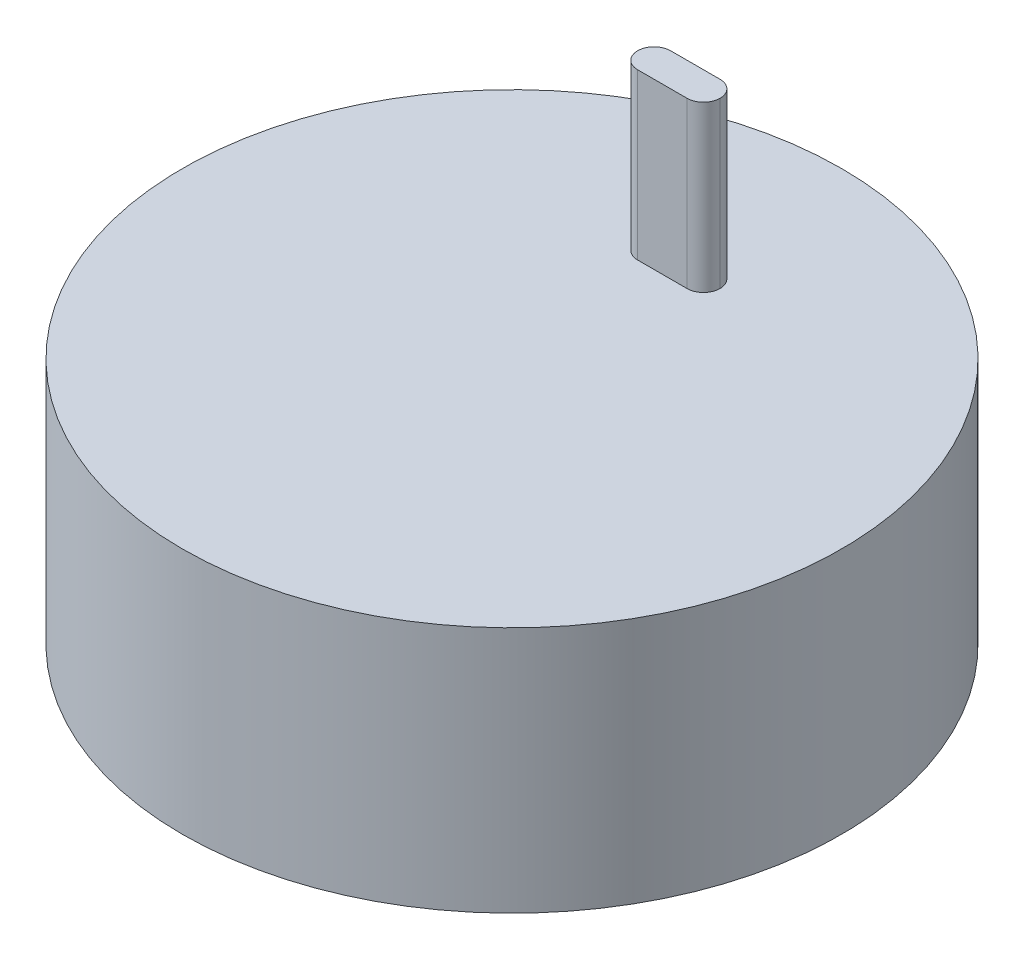
ISO-10303-21;
HEADER;
FILE_DESCRIPTION(('STEP AP214'),'2;1');
FILE_NAME('part.step','',(''),(''),'','','');
FILE_SCHEMA(('AUTOMOTIVE_DESIGN { 1 0 10303 214 1 1 1 1 }'));
ENDSEC;
DATA;
#1=APPLICATION_CONTEXT('core data for automotive mechanical design processes');
#2=APPLICATION_PROTOCOL_DEFINITION('international standard','automotive_design',2000,#1);
#3=PRODUCT_CONTEXT('',#1,'mechanical');
#4=PRODUCT('Part','Part','',(#3));
#5=PRODUCT_RELATED_PRODUCT_CATEGORY('part','',(#4));
#6=PRODUCT_DEFINITION_FORMATION('','',#4);
#7=PRODUCT_DEFINITION_CONTEXT('part definition',#1,'design');
#8=PRODUCT_DEFINITION('design','',#6,#7);
#9=PRODUCT_DEFINITION_SHAPE('','',#8);
#10=(LENGTH_UNIT() NAMED_UNIT(*) SI_UNIT(.MILLI.,.METRE.));
#11=(NAMED_UNIT(*) PLANE_ANGLE_UNIT() SI_UNIT($,.RADIAN.));
#12=(NAMED_UNIT(*) SI_UNIT($,.STERADIAN.) SOLID_ANGLE_UNIT());
#13=UNCERTAINTY_MEASURE_WITH_UNIT(LENGTH_MEASURE(1.E-05),#10,'distance_accuracy_value','');
#14=(GEOMETRIC_REPRESENTATION_CONTEXT(3) GLOBAL_UNCERTAINTY_ASSIGNED_CONTEXT((#13)) GLOBAL_UNIT_ASSIGNED_CONTEXT((#10,
#11,#12)) REPRESENTATION_CONTEXT('',''));
#15=CARTESIAN_POINT('',(0.,0.,0.));
#16=DIRECTION('',(0.,0.,1.));
#17=DIRECTION('',(1.,0.,0.));
#18=AXIS2_PLACEMENT_3D('',#15,#16,#17);
#19=CARTESIAN_POINT('',(0.,15.,0.));
#20=DIRECTION('',(0.,1.,0.));
#21=DIRECTION('',(0.,0.,1.));
#22=AXIS2_PLACEMENT_3D('',#19,#20,#21);
#23=PLANE('',#22);
#24=CARTESIAN_POINT('',(0.,15.,0.));
#25=DIRECTION('',(0.,1.,0.));
#26=DIRECTION('',(0.,0.,1.));
#27=AXIS2_PLACEMENT_3D('',#24,#25,#26);
#28=CIRCLE('',#27,20.);
#29=CARTESIAN_POINT('',(0.,15.,20.));
#30=VERTEX_POINT('',#29);
#31=EDGE_CURVE('E116',#30,#30,#28,.T.);
#32=ORIENTED_EDGE('',*,*,#31,.T.);
#33=EDGE_LOOP('',(#32));
#34=FACE_BOUND('',#33,.T.);
#35=DIRECTION('',(1.,0.,0.));
#36=VECTOR('',#35,1.);
#37=CARTESIAN_POINT('',(2.62526317716629,15.,-9.));
#38=LINE('',#37,#36);
#39=CARTESIAN_POINT('',(-1.37473682283371,15.,-9.));
#40=VERTEX_POINT('',#39);
#41=CARTESIAN_POINT('',(1.62526317716629,15.,-9.));
#42=VERTEX_POINT('',#41);
#43=EDGE_CURVE('E121',#40,#42,#38,.T.);
#44=ORIENTED_EDGE('',*,*,#43,.F.);
#45=CARTESIAN_POINT('',(-1.37473682283371,15.,-10.));
#46=DIRECTION('',(0.,1.,0.));
#47=DIRECTION('',(0.,0.,1.));
#48=AXIS2_PLACEMENT_3D('',#45,#46,#47);
#49=CIRCLE('',#48,1.);
#50=CARTESIAN_POINT('',(-2.37473682283371,15.,-10.));
#51=VERTEX_POINT('',#50);
#52=EDGE_CURVE('E53',#40,#51,#49,.F.);
#53=ORIENTED_EDGE('',*,*,#52,.T.);
#54=CARTESIAN_POINT('',(-1.37473682283371,15.,-10.));
#55=DIRECTION('',(0.,1.,0.));
#56=DIRECTION('',(0.,0.,1.));
#57=AXIS2_PLACEMENT_3D('',#54,#55,#56);
#58=CIRCLE('',#57,1.);
#59=CARTESIAN_POINT('',(-1.37473682283371,15.,-11.));
#60=VERTEX_POINT('',#59);
#61=EDGE_CURVE('E103',#51,#60,#58,.F.);
#62=ORIENTED_EDGE('',*,*,#61,.T.);
#63=DIRECTION('',(-1.,0.,0.));
#64=VECTOR('',#63,1.);
#65=CARTESIAN_POINT('',(2.62526317716629,15.,-11.));
#66=LINE('',#65,#64);
#67=CARTESIAN_POINT('',(1.62526317716629,15.,-11.));
#68=VERTEX_POINT('',#67);
#69=EDGE_CURVE('E110',#68,#60,#66,.T.);
#70=ORIENTED_EDGE('',*,*,#69,.F.);
#71=CARTESIAN_POINT('',(1.62526317716629,15.,-10.));
#72=DIRECTION('',(0.,1.,0.));
#73=DIRECTION('',(0.,0.,1.));
#74=AXIS2_PLACEMENT_3D('',#71,#72,#73);
#75=CIRCLE('',#74,1.);
#76=CARTESIAN_POINT('',(2.62526317716629,15.,-10.));
#77=VERTEX_POINT('',#76);
#78=EDGE_CURVE('E60',#68,#77,#75,.F.);
#79=ORIENTED_EDGE('',*,*,#78,.T.);
#80=CARTESIAN_POINT('',(1.62526317716629,15.,-10.));
#81=DIRECTION('',(0.,1.,0.));
#82=DIRECTION('',(0.,0.,1.));
#83=AXIS2_PLACEMENT_3D('',#80,#81,#82);
#84=CIRCLE('',#83,1.);
#85=EDGE_CURVE('E11',#77,#42,#84,.F.);
#86=ORIENTED_EDGE('',*,*,#85,.T.);
#87=EDGE_LOOP('',(#44,#53,#62,#70,#79,#86));
#88=FACE_BOUND('',#87,.T.);
#89=ADVANCED_FACE('F43',(#34,#88),#23,.T.);
#90=CARTESIAN_POINT('',(0.,15.,0.));
#91=DIRECTION('',(0.,-1.,0.));
#92=DIRECTION('',(0.,0.,-1.));
#93=AXIS2_PLACEMENT_3D('',#90,#91,#92);
#94=CYLINDRICAL_SURFACE('',#93,20.);
#95=ORIENTED_EDGE('',*,*,#31,.F.);
#96=EDGE_LOOP('',(#95));
#97=FACE_BOUND('',#96,.T.);
#98=CARTESIAN_POINT('',(0.,0.,0.));
#99=DIRECTION('',(0.,1.,0.));
#100=DIRECTION('',(0.,0.,1.));
#101=AXIS2_PLACEMENT_3D('',#98,#99,#100);
#102=CIRCLE('',#101,20.);
#103=CARTESIAN_POINT('',(0.,0.,20.));
#104=VERTEX_POINT('',#103);
#105=EDGE_CURVE('E135',#104,#104,#102,.T.);
#106=ORIENTED_EDGE('',*,*,#105,.T.);
#107=EDGE_LOOP('',(#106));
#108=FACE_BOUND('',#107,.T.);
#109=ADVANCED_FACE('F187',(#97,#108),#94,.T.);
#110=CARTESIAN_POINT('',(0.,0.,0.));
#111=DIRECTION('',(0.,1.,0.));
#112=DIRECTION('',(0.,0.,1.));
#113=AXIS2_PLACEMENT_3D('',#110,#111,#112);
#114=PLANE('',#113);
#115=ORIENTED_EDGE('',*,*,#105,.F.);
#116=EDGE_LOOP('',(#115));
#117=FACE_BOUND('',#116,.T.);
#118=ADVANCED_FACE('F195',(#117),#114,.F.);
#119=CARTESIAN_POINT('',(2.62526317716629,25.,-9.));
#120=DIRECTION('',(0.,0.,-1.));
#121=DIRECTION('',(-1.,0.,0.));
#122=AXIS2_PLACEMENT_3D('',#119,#120,#121);
#123=PLANE('',#122);
#124=DIRECTION('',(1.,0.,0.));
#125=VECTOR('',#124,1.);
#126=CARTESIAN_POINT('',(2.62526317716629,25.,-9.));
#127=LINE('',#126,#125);
#128=CARTESIAN_POINT('',(-1.37473682283371,25.,-9.));
#129=VERTEX_POINT('',#128);
#130=CARTESIAN_POINT('',(1.62526317716629,25.,-9.));
#131=VERTEX_POINT('',#130);
#132=EDGE_CURVE('E120',#129,#131,#127,.T.);
#133=ORIENTED_EDGE('',*,*,#132,.F.);
#134=DIRECTION('',(0.,-1.,0.));
#135=VECTOR('',#134,1.);
#136=CARTESIAN_POINT('',(-1.37473682283371,25.,-9.));
#137=LINE('',#136,#135);
#138=EDGE_CURVE('E156',#129,#40,#137,.T.);
#139=ORIENTED_EDGE('',*,*,#138,.T.);
#140=ORIENTED_EDGE('',*,*,#43,.T.);
#141=DIRECTION('',(0.,-1.,0.));
#142=VECTOR('',#141,1.);
#143=CARTESIAN_POINT('',(1.62526317716629,25.,-9.));
#144=LINE('',#143,#142);
#145=EDGE_CURVE('E153',#42,#131,#144,.F.);
#146=ORIENTED_EDGE('',*,*,#145,.T.);
#147=EDGE_LOOP('',(#133,#139,#140,#146));
#148=FACE_BOUND('',#147,.T.);
#149=ADVANCED_FACE('F176',(#148),#123,.F.);
#150=CARTESIAN_POINT('',(2.62526317716629,25.,-11.));
#151=DIRECTION('',(0.,0.,1.));
#152=DIRECTION('',(1.,0.,0.));
#153=AXIS2_PLACEMENT_3D('',#150,#151,#152);
#154=PLANE('',#153);
#155=ORIENTED_EDGE('',*,*,#69,.T.);
#156=DIRECTION('',(0.,-1.,0.));
#157=VECTOR('',#156,1.);
#158=CARTESIAN_POINT('',(-1.37473682283371,25.,-11.));
#159=LINE('',#158,#157);
#160=CARTESIAN_POINT('',(-1.37473682283371,25.,-11.));
#161=VERTEX_POINT('',#160);
#162=EDGE_CURVE('E115',#60,#161,#159,.F.);
#163=ORIENTED_EDGE('',*,*,#162,.T.);
#164=DIRECTION('',(-1.,0.,0.));
#165=VECTOR('',#164,1.);
#166=CARTESIAN_POINT('',(2.62526317716629,25.,-11.));
#167=LINE('',#166,#165);
#168=CARTESIAN_POINT('',(1.62526317716629,25.,-11.));
#169=VERTEX_POINT('',#168);
#170=EDGE_CURVE('E113',#169,#161,#167,.T.);
#171=ORIENTED_EDGE('',*,*,#170,.F.);
#172=DIRECTION('',(0.,-1.,0.));
#173=VECTOR('',#172,1.);
#174=CARTESIAN_POINT('',(1.62526317716629,25.,-11.));
#175=LINE('',#174,#173);
#176=EDGE_CURVE('E100',#169,#68,#175,.T.);
#177=ORIENTED_EDGE('',*,*,#176,.T.);
#178=EDGE_LOOP('',(#155,#163,#171,#177));
#179=FACE_BOUND('',#178,.T.);
#180=ADVANCED_FACE('F108',(#179),#154,.F.);
#181=CARTESIAN_POINT('',(0.,25.,0.));
#182=DIRECTION('',(0.,-1.,0.));
#183=DIRECTION('',(0.,0.,-1.));
#184=AXIS2_PLACEMENT_3D('',#181,#182,#183);
#185=PLANE('',#184);
#186=ORIENTED_EDGE('',*,*,#170,.T.);
#187=CARTESIAN_POINT('',(-1.37473682283371,25.,-10.));
#188=DIRECTION('',(0.,-1.,0.));
#189=DIRECTION('',(0.,0.,-1.));
#190=AXIS2_PLACEMENT_3D('',#187,#188,#189);
#191=CIRCLE('',#190,1.);
#192=CARTESIAN_POINT('',(-2.37473682283371,25.,-10.));
#193=VERTEX_POINT('',#192);
#194=EDGE_CURVE('E150',#161,#193,#191,.F.);
#195=ORIENTED_EDGE('',*,*,#194,.T.);
#196=CARTESIAN_POINT('',(-1.37473682283371,25.,-10.));
#197=DIRECTION('',(0.,-1.,0.));
#198=DIRECTION('',(0.,0.,-1.));
#199=AXIS2_PLACEMENT_3D('',#196,#197,#198);
#200=CIRCLE('',#199,1.);
#201=EDGE_CURVE('E147',#193,#129,#200,.F.);
#202=ORIENTED_EDGE('',*,*,#201,.T.);
#203=ORIENTED_EDGE('',*,*,#132,.T.);
#204=CARTESIAN_POINT('',(1.62526317716629,25.,-10.));
#205=DIRECTION('',(0.,-1.,0.));
#206=DIRECTION('',(0.,0.,-1.));
#207=AXIS2_PLACEMENT_3D('',#204,#205,#206);
#208=CIRCLE('',#207,1.);
#209=CARTESIAN_POINT('',(2.62526317716629,25.,-10.));
#210=VERTEX_POINT('',#209);
#211=EDGE_CURVE('E141',#131,#210,#208,.F.);
#212=ORIENTED_EDGE('',*,*,#211,.T.);
#213=CARTESIAN_POINT('',(1.62526317716629,25.,-10.));
#214=DIRECTION('',(0.,-1.,0.));
#215=DIRECTION('',(0.,0.,-1.));
#216=AXIS2_PLACEMENT_3D('',#213,#214,#215);
#217=CIRCLE('',#216,1.);
#218=EDGE_CURVE('E144',#210,#169,#217,.F.);
#219=ORIENTED_EDGE('',*,*,#218,.T.);
#220=EDGE_LOOP('',(#186,#195,#202,#203,#212,#219));
#221=FACE_BOUND('',#220,.T.);
#222=ADVANCED_FACE('F173',(#221),#185,.F.);
#223=CARTESIAN_POINT('',(-1.37473682283371,25.,-10.));
#224=DIRECTION('',(0.,-1.,0.));
#225=DIRECTION('',(0.,0.,-1.));
#226=AXIS2_PLACEMENT_3D('',#223,#224,#225);
#227=CYLINDRICAL_SURFACE('',#226,1.);
#228=ORIENTED_EDGE('',*,*,#138,.F.);
#229=ORIENTED_EDGE('',*,*,#201,.F.);
#230=DIRECTION('',(0.,-1.,0.));
#231=VECTOR('',#230,1.);
#232=CARTESIAN_POINT('',(-2.37473682283371,25.,-10.));
#233=LINE('',#232,#231);
#234=EDGE_CURVE('E128',#51,#193,#233,.F.);
#235=ORIENTED_EDGE('',*,*,#234,.F.);
#236=ORIENTED_EDGE('',*,*,#52,.F.);
#237=EDGE_LOOP('',(#228,#229,#235,#236));
#238=FACE_BOUND('',#237,.T.);
#239=ADVANCED_FACE('F170',(#238),#227,.T.);
#240=CARTESIAN_POINT('',(-1.37473682283371,25.,-10.));
#241=DIRECTION('',(0.,-1.,0.));
#242=DIRECTION('',(0.,0.,-1.));
#243=AXIS2_PLACEMENT_3D('',#240,#241,#242);
#244=CYLINDRICAL_SURFACE('',#243,1.);
#245=ORIENTED_EDGE('',*,*,#194,.F.);
#246=ORIENTED_EDGE('',*,*,#162,.F.);
#247=ORIENTED_EDGE('',*,*,#61,.F.);
#248=ORIENTED_EDGE('',*,*,#234,.T.);
#249=EDGE_LOOP('',(#245,#246,#247,#248));
#250=FACE_BOUND('',#249,.T.);
#251=ADVANCED_FACE('F166',(#250),#244,.T.);
#252=CARTESIAN_POINT('',(1.62526317716629,25.,-10.));
#253=DIRECTION('',(0.,-1.,0.));
#254=DIRECTION('',(0.,0.,-1.));
#255=AXIS2_PLACEMENT_3D('',#252,#253,#254);
#256=CYLINDRICAL_SURFACE('',#255,1.);
#257=DIRECTION('',(0.,-1.,0.));
#258=VECTOR('',#257,1.);
#259=CARTESIAN_POINT('',(2.62526317716629,25.,-10.));
#260=LINE('',#259,#258);
#261=EDGE_CURVE('E47',#210,#77,#260,.T.);
#262=ORIENTED_EDGE('',*,*,#261,.F.);
#263=ORIENTED_EDGE('',*,*,#211,.F.);
#264=ORIENTED_EDGE('',*,*,#145,.F.);
#265=ORIENTED_EDGE('',*,*,#85,.F.);
#266=EDGE_LOOP('',(#262,#263,#264,#265));
#267=FACE_BOUND('',#266,.T.);
#268=ADVANCED_FACE('F45',(#267),#256,.T.);
#269=CARTESIAN_POINT('',(1.62526317716629,25.,-10.));
#270=DIRECTION('',(0.,-1.,0.));
#271=DIRECTION('',(0.,0.,-1.));
#272=AXIS2_PLACEMENT_3D('',#269,#270,#271);
#273=CYLINDRICAL_SURFACE('',#272,1.);
#274=ORIENTED_EDGE('',*,*,#218,.F.);
#275=ORIENTED_EDGE('',*,*,#261,.T.);
#276=ORIENTED_EDGE('',*,*,#78,.F.);
#277=ORIENTED_EDGE('',*,*,#176,.F.);
#278=EDGE_LOOP('',(#274,#275,#276,#277));
#279=FACE_BOUND('',#278,.T.);
#280=ADVANCED_FACE('F99',(#279),#273,.T.);
#281=CLOSED_SHELL('',(#89,#109,#118,#149,#180,#222,#239,#251,#268,#280));
#282=MANIFOLD_SOLID_BREP('B2',#281);
#283=ADVANCED_BREP_SHAPE_REPRESENTATION('',(#18,#282),#14);
#284=SHAPE_DEFINITION_REPRESENTATION(#9,#283);
ENDSEC;
END-ISO-10303-21;
